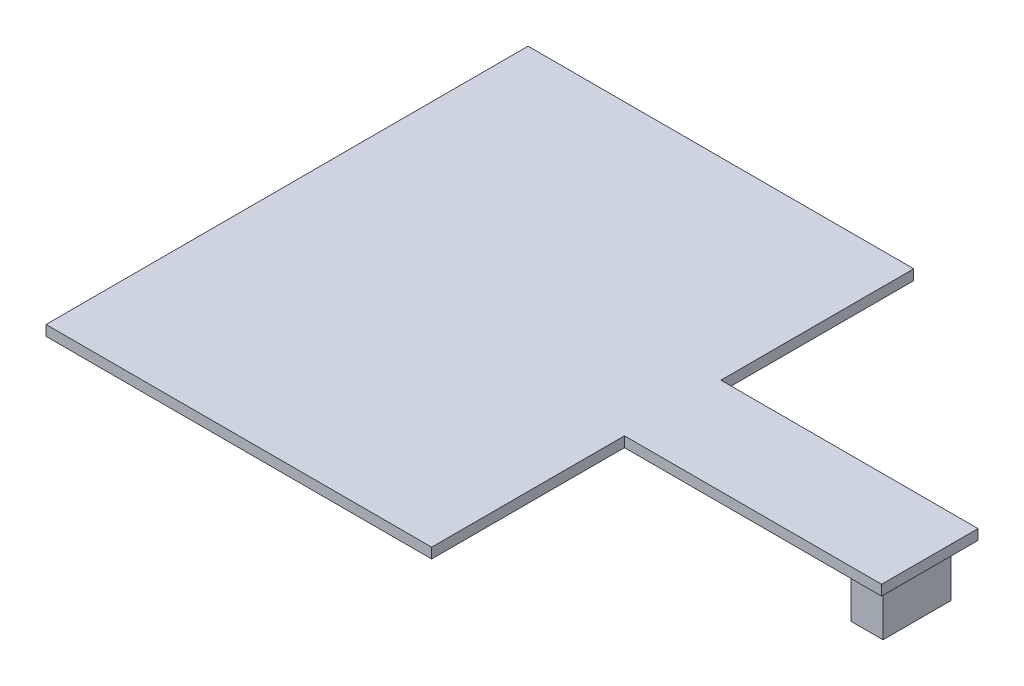
ISO-10303-21;
HEADER;
FILE_DESCRIPTION(('STEP AP214'),'2;1');
FILE_NAME('part.step','',(''),(''),'','','');
FILE_SCHEMA(('AUTOMOTIVE_DESIGN { 1 0 10303 214 1 1 1 1 }'));
ENDSEC;
DATA;
#1=APPLICATION_CONTEXT('core data for automotive mechanical design processes');
#2=APPLICATION_PROTOCOL_DEFINITION('international standard','automotive_design',2000,#1);
#3=PRODUCT_CONTEXT('',#1,'mechanical');
#4=PRODUCT('Part','Part','',(#3));
#5=PRODUCT_RELATED_PRODUCT_CATEGORY('part','',(#4));
#6=PRODUCT_DEFINITION_FORMATION('','',#4);
#7=PRODUCT_DEFINITION_CONTEXT('part definition',#1,'design');
#8=PRODUCT_DEFINITION('design','',#6,#7);
#9=PRODUCT_DEFINITION_SHAPE('','',#8);
#10=(LENGTH_UNIT() NAMED_UNIT(*) SI_UNIT(.MILLI.,.METRE.));
#11=(NAMED_UNIT(*) PLANE_ANGLE_UNIT() SI_UNIT($,.RADIAN.));
#12=(NAMED_UNIT(*) SI_UNIT($,.STERADIAN.) SOLID_ANGLE_UNIT());
#13=UNCERTAINTY_MEASURE_WITH_UNIT(LENGTH_MEASURE(1.E-05),#10,'distance_accuracy_value','');
#14=(GEOMETRIC_REPRESENTATION_CONTEXT(3) GLOBAL_UNCERTAINTY_ASSIGNED_CONTEXT((#13)) GLOBAL_UNIT_ASSIGNED_CONTEXT((#10,
#11,#12)) REPRESENTATION_CONTEXT('',''));
#15=CARTESIAN_POINT('',(0.,0.,0.));
#16=DIRECTION('',(0.,0.,1.));
#17=DIRECTION('',(1.,0.,0.));
#18=AXIS2_PLACEMENT_3D('',#15,#16,#17);
#19=CARTESIAN_POINT('',(0.,-1.6,0.));
#20=DIRECTION('',(0.,1.,0.));
#21=DIRECTION('',(0.,0.,1.));
#22=AXIS2_PLACEMENT_3D('',#19,#20,#21);
#23=PLANE('',#22);
#24=DIRECTION('',(1.,0.,0.));
#25=VECTOR('',#24,1.);
#26=CARTESIAN_POINT('',(0.,-1.6,37.5));
#27=LINE('',#26,#25);
#28=CARTESIAN_POINT('',(-30.,-1.6,37.5));
#29=VERTEX_POINT('',#28);
#30=CARTESIAN_POINT('',(30.,-1.6,37.5));
#31=VERTEX_POINT('',#30);
#32=EDGE_CURVE('E153',#29,#31,#27,.T.);
#33=ORIENTED_EDGE('',*,*,#32,.F.);
#34=DIRECTION('',(0.,0.,-1.));
#35=VECTOR('',#34,1.);
#36=CARTESIAN_POINT('',(-30.,-1.6,0.));
#37=LINE('',#36,#35);
#38=CARTESIAN_POINT('',(-30.,-1.6,-37.5));
#39=VERTEX_POINT('',#38);
#40=EDGE_CURVE('E171',#29,#39,#37,.T.);
#41=ORIENTED_EDGE('',*,*,#40,.T.);
#42=DIRECTION('',(1.,0.,0.));
#43=VECTOR('',#42,1.);
#44=CARTESIAN_POINT('',(0.,-1.6,-37.5));
#45=LINE('',#44,#43);
#46=CARTESIAN_POINT('',(30.,-1.6,-37.5));
#47=VERTEX_POINT('',#46);
#48=EDGE_CURVE('E169',#39,#47,#45,.T.);
#49=ORIENTED_EDGE('',*,*,#48,.T.);
#50=DIRECTION('',(0.,0.,-1.));
#51=VECTOR('',#50,1.);
#52=CARTESIAN_POINT('',(30.,-1.6,0.));
#53=LINE('',#52,#51);
#54=CARTESIAN_POINT('',(30.,-1.6,-7.5));
#55=VERTEX_POINT('',#54);
#56=EDGE_CURVE('E161',#55,#47,#53,.T.);
#57=ORIENTED_EDGE('',*,*,#56,.F.);
#58=DIRECTION('',(-1.,0.,0.));
#59=VECTOR('',#58,1.);
#60=CARTESIAN_POINT('',(0.,-1.6,-7.49999999999999));
#61=LINE('',#60,#59);
#62=CARTESIAN_POINT('',(70.,-1.6,-7.5));
#63=VERTEX_POINT('',#62);
#64=EDGE_CURVE('E166',#63,#55,#61,.T.);
#65=ORIENTED_EDGE('',*,*,#64,.F.);
#66=DIRECTION('',(0.,0.,-1.));
#67=VECTOR('',#66,1.);
#68=CARTESIAN_POINT('',(70.,-1.6,0.));
#69=LINE('',#68,#67);
#70=CARTESIAN_POINT('',(70.,-1.6,7.5));
#71=VERTEX_POINT('',#70);
#72=EDGE_CURVE('E163',#71,#63,#69,.T.);
#73=ORIENTED_EDGE('',*,*,#72,.F.);
#74=DIRECTION('',(-1.,0.,0.));
#75=VECTOR('',#74,1.);
#76=CARTESIAN_POINT('',(0.,-1.6,7.50000000000001));
#77=LINE('',#76,#75);
#78=CARTESIAN_POINT('',(30.,-1.6,7.5));
#79=VERTEX_POINT('',#78);
#80=EDGE_CURVE('E160',#71,#79,#77,.T.);
#81=ORIENTED_EDGE('',*,*,#80,.T.);
#82=EDGE_CURVE('E156',#31,#79,#53,.T.);
#83=ORIENTED_EDGE('',*,*,#82,.F.);
#84=EDGE_LOOP('',(#33,#41,#49,#57,#65,#73,#81,#83));
#85=FACE_BOUND('',#84,.T.);
#86=DIRECTION('',(0.,0.,1.));
#87=VECTOR('',#86,1.);
#88=CARTESIAN_POINT('',(68.,-1.6,-5.27999999999999));
#89=LINE('',#88,#87);
#90=CARTESIAN_POINT('',(68.,-1.6,-5.27999999999999));
#91=VERTEX_POINT('',#90);
#92=CARTESIAN_POINT('',(68.,-1.6,5.28000000000001));
#93=VERTEX_POINT('',#92);
#94=EDGE_CURVE('E143',#91,#93,#89,.T.);
#95=ORIENTED_EDGE('',*,*,#94,.F.);
#96=DIRECTION('',(1.,0.,0.));
#97=VECTOR('',#96,1.);
#98=CARTESIAN_POINT('',(63.,-1.6,-5.27999999999999));
#99=LINE('',#98,#97);
#100=CARTESIAN_POINT('',(63.,-1.6,-5.27999999999999));
#101=VERTEX_POINT('',#100);
#102=EDGE_CURVE('E140',#101,#91,#99,.T.);
#103=ORIENTED_EDGE('',*,*,#102,.F.);
#104=DIRECTION('',(0.,0.,-1.));
#105=VECTOR('',#104,1.);
#106=CARTESIAN_POINT('',(63.,-1.6,-5.27999999999999));
#107=LINE('',#106,#105);
#108=CARTESIAN_POINT('',(63.,-1.6,5.28000000000001));
#109=VERTEX_POINT('',#108);
#110=EDGE_CURVE('E55',#109,#101,#107,.T.);
#111=ORIENTED_EDGE('',*,*,#110,.F.);
#112=DIRECTION('',(-1.,0.,0.));
#113=VECTOR('',#112,1.);
#114=CARTESIAN_POINT('',(63.,-1.6,5.28000000000001));
#115=LINE('',#114,#113);
#116=EDGE_CURVE('E50',#93,#109,#115,.T.);
#117=ORIENTED_EDGE('',*,*,#116,.F.);
#118=EDGE_LOOP('',(#95,#103,#111,#117));
#119=FACE_BOUND('',#118,.T.);
#120=ADVANCED_FACE('F33',(#85,#119),#23,.F.);
#121=CARTESIAN_POINT('',(0.,-1.6,37.5));
#122=DIRECTION('',(0.,0.,1.));
#123=DIRECTION('',(1.,0.,0.));
#124=AXIS2_PLACEMENT_3D('',#121,#122,#123);
#125=PLANE('',#124);
#126=DIRECTION('',(1.,0.,0.));
#127=VECTOR('',#126,1.);
#128=CARTESIAN_POINT('',(0.,0.,37.5));
#129=LINE('',#128,#127);
#130=CARTESIAN_POINT('',(-30.,0.,37.5));
#131=VERTEX_POINT('',#130);
#132=CARTESIAN_POINT('',(30.,0.,37.5));
#133=VERTEX_POINT('',#132);
#134=EDGE_CURVE('E144',#131,#133,#129,.T.);
#135=ORIENTED_EDGE('',*,*,#134,.F.);
#136=DIRECTION('',(0.,1.,0.));
#137=VECTOR('',#136,1.);
#138=CARTESIAN_POINT('',(-30.,-1.6,37.5));
#139=LINE('',#138,#137);
#140=EDGE_CURVE('E11',#29,#131,#139,.T.);
#141=ORIENTED_EDGE('',*,*,#140,.F.);
#142=ORIENTED_EDGE('',*,*,#32,.T.);
#143=DIRECTION('',(0.,1.,0.));
#144=VECTOR('',#143,1.);
#145=CARTESIAN_POINT('',(30.,-1.6,37.5));
#146=LINE('',#145,#144);
#147=EDGE_CURVE('E37',#31,#133,#146,.T.);
#148=ORIENTED_EDGE('',*,*,#147,.T.);
#149=EDGE_LOOP('',(#135,#141,#142,#148));
#150=FACE_BOUND('',#149,.T.);
#151=ADVANCED_FACE('F35',(#150),#125,.T.);
#152=CARTESIAN_POINT('',(-30.,-1.6,0.));
#153=DIRECTION('',(1.,0.,0.));
#154=DIRECTION('',(0.,0.,-1.));
#155=AXIS2_PLACEMENT_3D('',#152,#153,#154);
#156=PLANE('',#155);
#157=DIRECTION('',(0.,0.,-1.));
#158=VECTOR('',#157,1.);
#159=CARTESIAN_POINT('',(-30.,0.,0.));
#160=LINE('',#159,#158);
#161=CARTESIAN_POINT('',(-30.,0.,-37.5));
#162=VERTEX_POINT('',#161);
#163=EDGE_CURVE('E157',#131,#162,#160,.T.);
#164=ORIENTED_EDGE('',*,*,#163,.T.);
#165=DIRECTION('',(0.,1.,0.));
#166=VECTOR('',#165,1.);
#167=CARTESIAN_POINT('',(-30.,-1.6,-37.5));
#168=LINE('',#167,#166);
#169=EDGE_CURVE('E42',#39,#162,#168,.T.);
#170=ORIENTED_EDGE('',*,*,#169,.F.);
#171=ORIENTED_EDGE('',*,*,#40,.F.);
#172=ORIENTED_EDGE('',*,*,#140,.T.);
#173=EDGE_LOOP('',(#164,#170,#171,#172));
#174=FACE_BOUND('',#173,.T.);
#175=ADVANCED_FACE('F215',(#174),#156,.F.);
#176=CARTESIAN_POINT('',(0.,-1.6,-37.5));
#177=DIRECTION('',(0.,0.,1.));
#178=DIRECTION('',(1.,0.,0.));
#179=AXIS2_PLACEMENT_3D('',#176,#177,#178);
#180=PLANE('',#179);
#181=DIRECTION('',(1.,0.,0.));
#182=VECTOR('',#181,1.);
#183=CARTESIAN_POINT('',(0.,0.,-37.5));
#184=LINE('',#183,#182);
#185=CARTESIAN_POINT('',(30.,0.,-37.5));
#186=VERTEX_POINT('',#185);
#187=EDGE_CURVE('E185',#162,#186,#184,.T.);
#188=ORIENTED_EDGE('',*,*,#187,.T.);
#189=DIRECTION('',(0.,1.,0.));
#190=VECTOR('',#189,1.);
#191=CARTESIAN_POINT('',(30.,-1.6,-37.5));
#192=LINE('',#191,#190);
#193=EDGE_CURVE('E191',#47,#186,#192,.T.);
#194=ORIENTED_EDGE('',*,*,#193,.F.);
#195=ORIENTED_EDGE('',*,*,#48,.F.);
#196=ORIENTED_EDGE('',*,*,#169,.T.);
#197=EDGE_LOOP('',(#188,#194,#195,#196));
#198=FACE_BOUND('',#197,.T.);
#199=ADVANCED_FACE('F219',(#198),#180,.F.);
#200=CARTESIAN_POINT('',(30.,-1.6,0.));
#201=DIRECTION('',(1.,0.,0.));
#202=DIRECTION('',(0.,0.,-1.));
#203=AXIS2_PLACEMENT_3D('',#200,#201,#202);
#204=PLANE('',#203);
#205=DIRECTION('',(0.,0.,-1.));
#206=VECTOR('',#205,1.);
#207=CARTESIAN_POINT('',(30.,0.,0.));
#208=LINE('',#207,#206);
#209=CARTESIAN_POINT('',(30.,0.,-7.5));
#210=VERTEX_POINT('',#209);
#211=EDGE_CURVE('E176',#210,#186,#208,.T.);
#212=ORIENTED_EDGE('',*,*,#211,.F.);
#213=DIRECTION('',(0.,1.,0.));
#214=VECTOR('',#213,1.);
#215=CARTESIAN_POINT('',(30.,-1.6,-7.5));
#216=LINE('',#215,#214);
#217=EDGE_CURVE('E193',#55,#210,#216,.T.);
#218=ORIENTED_EDGE('',*,*,#217,.F.);
#219=ORIENTED_EDGE('',*,*,#56,.T.);
#220=ORIENTED_EDGE('',*,*,#193,.T.);
#221=EDGE_LOOP('',(#212,#218,#219,#220));
#222=FACE_BOUND('',#221,.T.);
#223=ADVANCED_FACE('F237',(#222),#204,.T.);
#224=CARTESIAN_POINT('',(0.,-1.6,-7.49999999999999));
#225=DIRECTION('',(0.,0.,-1.));
#226=DIRECTION('',(-1.,0.,0.));
#227=AXIS2_PLACEMENT_3D('',#224,#225,#226);
#228=PLANE('',#227);
#229=DIRECTION('',(-1.,0.,0.));
#230=VECTOR('',#229,1.);
#231=CARTESIAN_POINT('',(0.,0.,-7.49999999999999));
#232=LINE('',#231,#230);
#233=CARTESIAN_POINT('',(70.,0.,-7.5));
#234=VERTEX_POINT('',#233);
#235=EDGE_CURVE('E182',#234,#210,#232,.T.);
#236=ORIENTED_EDGE('',*,*,#235,.F.);
#237=DIRECTION('',(0.,1.,0.));
#238=VECTOR('',#237,1.);
#239=CARTESIAN_POINT('',(70.,-1.6,-7.5));
#240=LINE('',#239,#238);
#241=EDGE_CURVE('E195',#63,#234,#240,.T.);
#242=ORIENTED_EDGE('',*,*,#241,.F.);
#243=ORIENTED_EDGE('',*,*,#64,.T.);
#244=ORIENTED_EDGE('',*,*,#217,.T.);
#245=EDGE_LOOP('',(#236,#242,#243,#244));
#246=FACE_BOUND('',#245,.T.);
#247=ADVANCED_FACE('F234',(#246),#228,.T.);
#248=CARTESIAN_POINT('',(70.,-1.6,0.));
#249=DIRECTION('',(1.,0.,0.));
#250=DIRECTION('',(0.,0.,-1.));
#251=AXIS2_PLACEMENT_3D('',#248,#249,#250);
#252=PLANE('',#251);
#253=DIRECTION('',(0.,0.,-1.));
#254=VECTOR('',#253,1.);
#255=CARTESIAN_POINT('',(70.,0.,0.));
#256=LINE('',#255,#254);
#257=CARTESIAN_POINT('',(70.,0.,7.5));
#258=VERTEX_POINT('',#257);
#259=EDGE_CURVE('E179',#258,#234,#256,.T.);
#260=ORIENTED_EDGE('',*,*,#259,.F.);
#261=DIRECTION('',(0.,1.,0.));
#262=VECTOR('',#261,1.);
#263=CARTESIAN_POINT('',(70.,-1.6,7.5));
#264=LINE('',#263,#262);
#265=EDGE_CURVE('E197',#71,#258,#264,.T.);
#266=ORIENTED_EDGE('',*,*,#265,.F.);
#267=ORIENTED_EDGE('',*,*,#72,.T.);
#268=ORIENTED_EDGE('',*,*,#241,.T.);
#269=EDGE_LOOP('',(#260,#266,#267,#268));
#270=FACE_BOUND('',#269,.T.);
#271=ADVANCED_FACE('F231',(#270),#252,.T.);
#272=CARTESIAN_POINT('',(0.,-1.6,7.50000000000001));
#273=DIRECTION('',(0.,0.,-1.));
#274=DIRECTION('',(-1.,0.,0.));
#275=AXIS2_PLACEMENT_3D('',#272,#273,#274);
#276=PLANE('',#275);
#277=DIRECTION('',(-1.,0.,0.));
#278=VECTOR('',#277,1.);
#279=CARTESIAN_POINT('',(0.,0.,7.50000000000001));
#280=LINE('',#279,#278);
#281=CARTESIAN_POINT('',(30.,0.,7.5));
#282=VERTEX_POINT('',#281);
#283=EDGE_CURVE('E175',#258,#282,#280,.T.);
#284=ORIENTED_EDGE('',*,*,#283,.T.);
#285=DIRECTION('',(0.,1.,0.));
#286=VECTOR('',#285,1.);
#287=CARTESIAN_POINT('',(30.,-1.6,7.5));
#288=LINE('',#287,#286);
#289=EDGE_CURVE('E198',#79,#282,#288,.T.);
#290=ORIENTED_EDGE('',*,*,#289,.F.);
#291=ORIENTED_EDGE('',*,*,#80,.F.);
#292=ORIENTED_EDGE('',*,*,#265,.T.);
#293=EDGE_LOOP('',(#284,#290,#291,#292));
#294=FACE_BOUND('',#293,.T.);
#295=ADVANCED_FACE('F228',(#294),#276,.F.);
#296=EDGE_CURVE('E147',#133,#282,#208,.T.);
#297=ORIENTED_EDGE('',*,*,#296,.F.);
#298=ORIENTED_EDGE('',*,*,#147,.F.);
#299=ORIENTED_EDGE('',*,*,#82,.T.);
#300=ORIENTED_EDGE('',*,*,#289,.T.);
#301=EDGE_LOOP('',(#297,#298,#299,#300));
#302=FACE_BOUND('',#301,.T.);
#303=ADVANCED_FACE('F206',(#302),#204,.T.);
#304=CARTESIAN_POINT('',(0.,0.,0.));
#305=DIRECTION('',(0.,1.,0.));
#306=DIRECTION('',(0.,0.,1.));
#307=AXIS2_PLACEMENT_3D('',#304,#305,#306);
#308=PLANE('',#307);
#309=ORIENTED_EDGE('',*,*,#134,.T.);
#310=ORIENTED_EDGE('',*,*,#296,.T.);
#311=ORIENTED_EDGE('',*,*,#283,.F.);
#312=ORIENTED_EDGE('',*,*,#259,.T.);
#313=ORIENTED_EDGE('',*,*,#235,.T.);
#314=ORIENTED_EDGE('',*,*,#211,.T.);
#315=ORIENTED_EDGE('',*,*,#187,.F.);
#316=ORIENTED_EDGE('',*,*,#163,.F.);
#317=EDGE_LOOP('',(#309,#310,#311,#312,#313,#314,#315,#316));
#318=FACE_BOUND('',#317,.T.);
#319=ADVANCED_FACE('F210',(#318),#308,.T.);
#320=CARTESIAN_POINT('',(68.,-9.6,-5.27999999999999));
#321=DIRECTION('',(-1.,0.,0.));
#322=DIRECTION('',(0.,0.,1.));
#323=AXIS2_PLACEMENT_3D('',#320,#321,#322);
#324=PLANE('',#323);
#325=ORIENTED_EDGE('',*,*,#94,.T.);
#326=DIRECTION('',(0.,1.,0.));
#327=VECTOR('',#326,1.);
#328=CARTESIAN_POINT('',(68.,-9.6,5.28000000000001));
#329=LINE('',#328,#327);
#330=CARTESIAN_POINT('',(68.,-9.6,5.28000000000001));
#331=VERTEX_POINT('',#330);
#332=EDGE_CURVE('E124',#331,#93,#329,.T.);
#333=ORIENTED_EDGE('',*,*,#332,.F.);
#334=DIRECTION('',(0.,0.,1.));
#335=VECTOR('',#334,1.);
#336=CARTESIAN_POINT('',(68.,-9.6,-5.27999999999999));
#337=LINE('',#336,#335);
#338=CARTESIAN_POINT('',(68.,-9.6,-5.27999999999999));
#339=VERTEX_POINT('',#338);
#340=EDGE_CURVE('E131',#339,#331,#337,.T.);
#341=ORIENTED_EDGE('',*,*,#340,.F.);
#342=DIRECTION('',(0.,1.,0.));
#343=VECTOR('',#342,1.);
#344=CARTESIAN_POINT('',(68.,-9.6,-5.27999999999999));
#345=LINE('',#344,#343);
#346=EDGE_CURVE('E361',#339,#91,#345,.T.);
#347=ORIENTED_EDGE('',*,*,#346,.T.);
#348=EDGE_LOOP('',(#325,#333,#341,#347));
#349=FACE_BOUND('',#348,.T.);
#350=ADVANCED_FACE('F142',(#349),#324,.F.);
#351=CARTESIAN_POINT('',(63.,-9.6,5.28000000000001));
#352=DIRECTION('',(0.,0.,-1.));
#353=DIRECTION('',(-1.,0.,0.));
#354=AXIS2_PLACEMENT_3D('',#351,#352,#353);
#355=PLANE('',#354);
#356=ORIENTED_EDGE('',*,*,#116,.T.);
#357=DIRECTION('',(0.,1.,0.));
#358=VECTOR('',#357,1.);
#359=CARTESIAN_POINT('',(63.,-9.6,5.28000000000001));
#360=LINE('',#359,#358);
#361=CARTESIAN_POINT('',(63.,-9.6,5.28000000000001));
#362=VERTEX_POINT('',#361);
#363=EDGE_CURVE('E127',#362,#109,#360,.T.);
#364=ORIENTED_EDGE('',*,*,#363,.F.);
#365=DIRECTION('',(-1.,0.,0.));
#366=VECTOR('',#365,1.);
#367=CARTESIAN_POINT('',(63.,-9.6,5.28000000000001));
#368=LINE('',#367,#366);
#369=EDGE_CURVE('E120',#331,#362,#368,.T.);
#370=ORIENTED_EDGE('',*,*,#369,.F.);
#371=ORIENTED_EDGE('',*,*,#332,.T.);
#372=EDGE_LOOP('',(#356,#364,#370,#371));
#373=FACE_BOUND('',#372,.T.);
#374=ADVANCED_FACE('F122',(#373),#355,.F.);
#375=CARTESIAN_POINT('',(63.,-9.6,-5.27999999999999));
#376=DIRECTION('',(1.,0.,0.));
#377=DIRECTION('',(0.,0.,-1.));
#378=AXIS2_PLACEMENT_3D('',#375,#376,#377);
#379=PLANE('',#378);
#380=ORIENTED_EDGE('',*,*,#110,.T.);
#381=DIRECTION('',(0.,1.,0.));
#382=VECTOR('',#381,1.);
#383=CARTESIAN_POINT('',(63.,-9.6,-5.27999999999999));
#384=LINE('',#383,#382);
#385=CARTESIAN_POINT('',(63.,-9.6,-5.27999999999999));
#386=VERTEX_POINT('',#385);
#387=EDGE_CURVE('E149',#386,#101,#384,.T.);
#388=ORIENTED_EDGE('',*,*,#387,.F.);
#389=DIRECTION('',(0.,0.,-1.));
#390=VECTOR('',#389,1.);
#391=CARTESIAN_POINT('',(63.,-9.6,-5.27999999999999));
#392=LINE('',#391,#390);
#393=EDGE_CURVE('E130',#362,#386,#392,.T.);
#394=ORIENTED_EDGE('',*,*,#393,.F.);
#395=ORIENTED_EDGE('',*,*,#363,.T.);
#396=EDGE_LOOP('',(#380,#388,#394,#395));
#397=FACE_BOUND('',#396,.T.);
#398=ADVANCED_FACE('F324',(#397),#379,.F.);
#399=CARTESIAN_POINT('',(63.,-9.6,-5.27999999999999));
#400=DIRECTION('',(0.,0.,1.));
#401=DIRECTION('',(1.,0.,0.));
#402=AXIS2_PLACEMENT_3D('',#399,#400,#401);
#403=PLANE('',#402);
#404=ORIENTED_EDGE('',*,*,#102,.T.);
#405=ORIENTED_EDGE('',*,*,#346,.F.);
#406=DIRECTION('',(1.,0.,0.));
#407=VECTOR('',#406,1.);
#408=CARTESIAN_POINT('',(63.,-9.6,-5.27999999999999));
#409=LINE('',#408,#407);
#410=EDGE_CURVE('E136',#386,#339,#409,.T.);
#411=ORIENTED_EDGE('',*,*,#410,.F.);
#412=ORIENTED_EDGE('',*,*,#387,.T.);
#413=EDGE_LOOP('',(#404,#405,#411,#412));
#414=FACE_BOUND('',#413,.T.);
#415=ADVANCED_FACE('F330',(#414),#403,.F.);
#416=CARTESIAN_POINT('',(0.,-9.6,0.));
#417=DIRECTION('',(0.,1.,0.));
#418=DIRECTION('',(0.,0.,1.));
#419=AXIS2_PLACEMENT_3D('',#416,#417,#418);
#420=PLANE('',#419);
#421=ORIENTED_EDGE('',*,*,#340,.T.);
#422=ORIENTED_EDGE('',*,*,#369,.T.);
#423=ORIENTED_EDGE('',*,*,#393,.T.);
#424=ORIENTED_EDGE('',*,*,#410,.T.);
#425=EDGE_LOOP('',(#421,#422,#423,#424));
#426=FACE_BOUND('',#425,.T.);
#427=ADVANCED_FACE('F134',(#426),#420,.F.);
#428=CLOSED_SHELL('',(#120,#151,#175,#199,#223,#247,#271,#295,#303,#319,#350,#374,#398,#415,#427));
#429=MANIFOLD_SOLID_BREP('B2',#428);
#430=ADVANCED_BREP_SHAPE_REPRESENTATION('',(#18,#429),#14);
#431=SHAPE_DEFINITION_REPRESENTATION(#9,#430);
ENDSEC;
END-ISO-10303-21;
